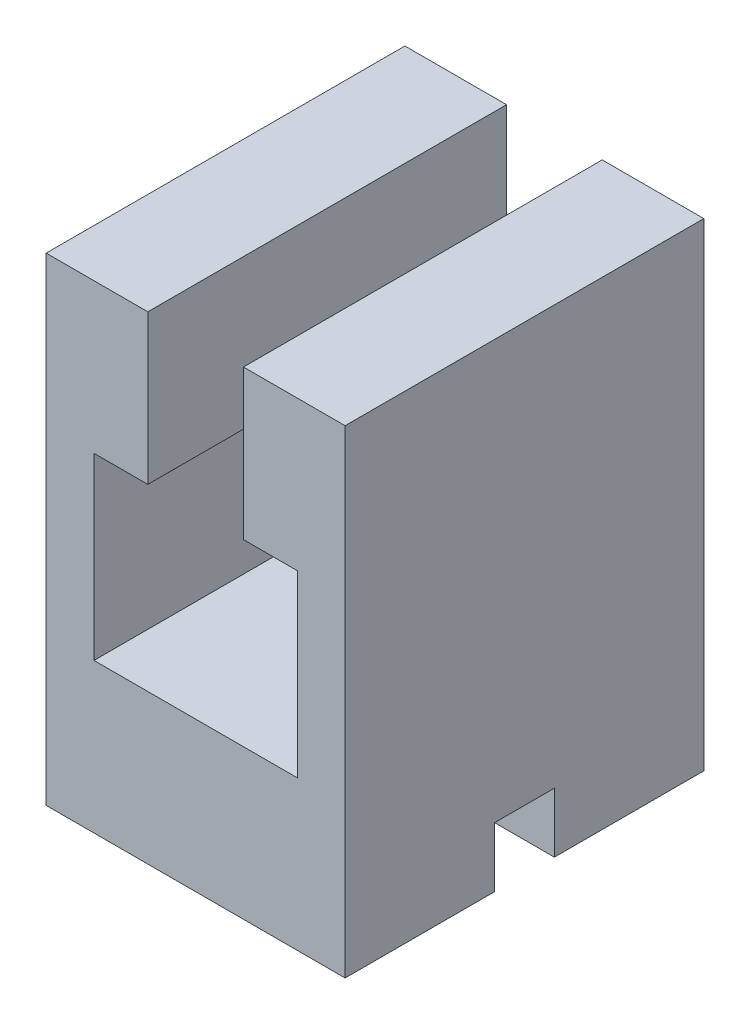
ISO-10303-21;
HEADER;
FILE_DESCRIPTION(('STEP AP214'),'2;1');
FILE_NAME('part.step','',(''),(''),'','','');
FILE_SCHEMA(('AUTOMOTIVE_DESIGN { 1 0 10303 214 1 1 1 1 }'));
ENDSEC;
DATA;
#1=APPLICATION_CONTEXT('core data for automotive mechanical design processes');
#2=APPLICATION_PROTOCOL_DEFINITION('international standard','automotive_design',2000,#1);
#3=PRODUCT_CONTEXT('',#1,'mechanical');
#4=PRODUCT('Part','Part','',(#3));
#5=PRODUCT_RELATED_PRODUCT_CATEGORY('part','',(#4));
#6=PRODUCT_DEFINITION_FORMATION('','',#4);
#7=PRODUCT_DEFINITION_CONTEXT('part definition',#1,'design');
#8=PRODUCT_DEFINITION('design','',#6,#7);
#9=PRODUCT_DEFINITION_SHAPE('','',#8);
#10=(LENGTH_UNIT() NAMED_UNIT(*) SI_UNIT(.MILLI.,.METRE.));
#11=(NAMED_UNIT(*) PLANE_ANGLE_UNIT() SI_UNIT($,.RADIAN.));
#12=(NAMED_UNIT(*) SI_UNIT($,.STERADIAN.) SOLID_ANGLE_UNIT());
#13=UNCERTAINTY_MEASURE_WITH_UNIT(LENGTH_MEASURE(1.E-05),#10,'distance_accuracy_value','');
#14=(GEOMETRIC_REPRESENTATION_CONTEXT(3) GLOBAL_UNCERTAINTY_ASSIGNED_CONTEXT((#13)) GLOBAL_UNIT_ASSIGNED_CONTEXT((#10,
#11,#12)) REPRESENTATION_CONTEXT('',''));
#15=CARTESIAN_POINT('',(0.,0.,0.));
#16=DIRECTION('',(0.,0.,1.));
#17=DIRECTION('',(1.,0.,0.));
#18=AXIS2_PLACEMENT_3D('',#15,#16,#17);
#19=CARTESIAN_POINT('',(-50.5403810221175,-30.6751493262531,60.));
#20=DIRECTION('',(0.,1.,0.));
#21=DIRECTION('',(0.,0.,1.));
#22=AXIS2_PLACEMENT_3D('',#19,#20,#21);
#23=PLANE('',#22);
#24=DIRECTION('',(0.,0.,-1.));
#25=VECTOR('',#24,1.);
#26=CARTESIAN_POINT('',(-0.540381022117523,-30.6751493262531,60.));
#27=LINE('',#26,#25);
#28=CARTESIAN_POINT('',(-0.540381022117523,-30.6751493262531,25.));
#29=VERTEX_POINT('',#28);
#30=CARTESIAN_POINT('',(-0.540381022117523,-30.6751493262531,0.));
#31=VERTEX_POINT('',#30);
#32=EDGE_CURVE('E245',#29,#31,#27,.T.);
#33=ORIENTED_EDGE('',*,*,#32,.F.);
#34=DIRECTION('',(-1.,0.,0.));
#35=VECTOR('',#34,1.);
#36=CARTESIAN_POINT('',(9.45961897788247,-30.6751493262531,25.));
#37=LINE('',#36,#35);
#38=CARTESIAN_POINT('',(-50.5403810221175,-30.6751493262531,25.));
#39=VERTEX_POINT('',#38);
#40=EDGE_CURVE('E288',#29,#39,#37,.T.);
#41=ORIENTED_EDGE('',*,*,#40,.T.);
#42=DIRECTION('',(0.,0.,-1.));
#43=VECTOR('',#42,1.);
#44=CARTESIAN_POINT('',(-50.5403810221175,-30.6751493262531,60.));
#45=LINE('',#44,#43);
#46=CARTESIAN_POINT('',(-50.5403810221175,-30.6751493262531,0.));
#47=VERTEX_POINT('',#46);
#48=EDGE_CURVE('E250',#39,#47,#45,.T.);
#49=ORIENTED_EDGE('',*,*,#48,.T.);
#50=DIRECTION('',(1.,0.,0.));
#51=VECTOR('',#50,1.);
#52=CARTESIAN_POINT('',(-50.5403810221175,-30.6751493262531,0.));
#53=LINE('',#52,#51);
#54=EDGE_CURVE('E181',#47,#31,#53,.T.);
#55=ORIENTED_EDGE('',*,*,#54,.T.);
#56=EDGE_LOOP('',(#33,#41,#49,#55));
#57=FACE_BOUND('',#56,.T.);
#58=ADVANCED_FACE('F39',(#57),#23,.F.);
#59=CARTESIAN_POINT('',(-50.5403810221175,49.3248506737469,60.));
#60=DIRECTION('',(1.,0.,0.));
#61=DIRECTION('',(0.,0.,-1.));
#62=AXIS2_PLACEMENT_3D('',#59,#60,#61);
#63=PLANE('',#62);
#64=ORIENTED_EDGE('',*,*,#48,.F.);
#65=DIRECTION('',(0.,-1.,0.));
#66=VECTOR('',#65,1.);
#67=CARTESIAN_POINT('',(-50.5403810221175,-30.6751493262531,25.));
#68=LINE('',#67,#66);
#69=CARTESIAN_POINT('',(-50.5403810221175,-20.6751493262531,25.));
#70=VERTEX_POINT('',#69);
#71=EDGE_CURVE('E359',#70,#39,#68,.T.);
#72=ORIENTED_EDGE('',*,*,#71,.F.);
#73=DIRECTION('',(0.,0.,-1.));
#74=VECTOR('',#73,1.);
#75=CARTESIAN_POINT('',(-50.5403810221175,-20.6751493262531,25.));
#76=LINE('',#75,#74);
#77=CARTESIAN_POINT('',(-50.5403810221175,-20.6751493262531,35.));
#78=VERTEX_POINT('',#77);
#79=EDGE_CURVE('E273',#78,#70,#76,.T.);
#80=ORIENTED_EDGE('',*,*,#79,.F.);
#81=DIRECTION('',(0.,1.,0.));
#82=VECTOR('',#81,1.);
#83=CARTESIAN_POINT('',(-50.5403810221175,-30.6751493262531,35.));
#84=LINE('',#83,#82);
#85=CARTESIAN_POINT('',(-50.5403810221175,-30.6751493262531,35.));
#86=VERTEX_POINT('',#85);
#87=EDGE_CURVE('E370',#86,#78,#84,.T.);
#88=ORIENTED_EDGE('',*,*,#87,.F.);
#89=CARTESIAN_POINT('',(-50.5403810221175,-30.6751493262531,60.));
#90=VERTEX_POINT('',#89);
#91=EDGE_CURVE('E251',#90,#86,#45,.T.);
#92=ORIENTED_EDGE('',*,*,#91,.F.);
#93=DIRECTION('',(0.,-1.,0.));
#94=VECTOR('',#93,1.);
#95=CARTESIAN_POINT('',(-50.5403810221175,49.3248506737469,60.));
#96=LINE('',#95,#94);
#97=CARTESIAN_POINT('',(-50.5403810221175,49.3248506737469,60.));
#98=VERTEX_POINT('',#97);
#99=EDGE_CURVE('E214',#98,#90,#96,.T.);
#100=ORIENTED_EDGE('',*,*,#99,.F.);
#101=DIRECTION('',(0.,0.,-1.));
#102=VECTOR('',#101,1.);
#103=CARTESIAN_POINT('',(-50.5403810221175,49.3248506737469,60.));
#104=LINE('',#103,#102);
#105=CARTESIAN_POINT('',(-50.5403810221175,49.3248506737469,0.));
#106=VERTEX_POINT('',#105);
#107=EDGE_CURVE('E173',#98,#106,#104,.T.);
#108=ORIENTED_EDGE('',*,*,#107,.T.);
#109=DIRECTION('',(0.,-1.,0.));
#110=VECTOR('',#109,1.);
#111=CARTESIAN_POINT('',(-50.5403810221175,49.3248506737469,0.));
#112=LINE('',#111,#110);
#113=EDGE_CURVE('E177',#106,#47,#112,.T.);
#114=ORIENTED_EDGE('',*,*,#113,.T.);
#115=EDGE_LOOP('',(#64,#72,#80,#88,#92,#100,#108,#114));
#116=FACE_BOUND('',#115,.T.);
#117=ADVANCED_FACE('F41',(#116),#63,.F.);
#118=ORIENTED_EDGE('',*,*,#91,.T.);
#119=DIRECTION('',(-1.,0.,0.));
#120=VECTOR('',#119,1.);
#121=CARTESIAN_POINT('',(9.45961897788247,-30.6751493262531,35.));
#122=LINE('',#121,#120);
#123=CARTESIAN_POINT('',(-0.540381022117523,-30.6751493262531,35.));
#124=VERTEX_POINT('',#123);
#125=EDGE_CURVE('E280',#124,#86,#122,.T.);
#126=ORIENTED_EDGE('',*,*,#125,.F.);
#127=CARTESIAN_POINT('',(-0.540381022117523,-30.6751493262531,60.));
#128=VERTEX_POINT('',#127);
#129=EDGE_CURVE('E246',#128,#124,#27,.T.);
#130=ORIENTED_EDGE('',*,*,#129,.F.);
#131=DIRECTION('',(1.,0.,0.));
#132=VECTOR('',#131,1.);
#133=CARTESIAN_POINT('',(-50.5403810221175,-30.6751493262531,60.));
#134=LINE('',#133,#132);
#135=EDGE_CURVE('E118',#90,#128,#134,.T.);
#136=ORIENTED_EDGE('',*,*,#135,.F.);
#137=EDGE_LOOP('',(#118,#126,#130,#136));
#138=FACE_BOUND('',#137,.T.);
#139=ADVANCED_FACE('F336',(#138),#23,.F.);
#140=CARTESIAN_POINT('',(-0.540381022117523,-30.6751493262531,60.));
#141=DIRECTION('',(-1.,0.,0.));
#142=DIRECTION('',(0.,0.,1.));
#143=AXIS2_PLACEMENT_3D('',#140,#141,#142);
#144=PLANE('',#143);
#145=DIRECTION('',(0.,0.,-1.));
#146=VECTOR('',#145,1.);
#147=CARTESIAN_POINT('',(-0.540381022117523,-20.6751493262531,60.));
#148=LINE('',#147,#146);
#149=CARTESIAN_POINT('',(-0.540381022117523,-20.6751493262531,35.));
#150=VERTEX_POINT('',#149);
#151=CARTESIAN_POINT('',(-0.540381022117523,-20.6751493262531,25.));
#152=VERTEX_POINT('',#151);
#153=EDGE_CURVE('E48',#150,#152,#148,.T.);
#154=ORIENTED_EDGE('',*,*,#153,.T.);
#155=DIRECTION('',(0.,-1.,0.));
#156=VECTOR('',#155,1.);
#157=CARTESIAN_POINT('',(-0.540381022117523,-30.6751493262531,25.));
#158=LINE('',#157,#156);
#159=EDGE_CURVE('E11',#152,#29,#158,.T.);
#160=ORIENTED_EDGE('',*,*,#159,.T.);
#161=ORIENTED_EDGE('',*,*,#32,.T.);
#162=DIRECTION('',(0.,1.,0.));
#163=VECTOR('',#162,1.);
#164=CARTESIAN_POINT('',(-0.540381022117523,-30.6751493262531,0.));
#165=LINE('',#164,#163);
#166=CARTESIAN_POINT('',(-0.540381022117523,49.3248506737469,0.));
#167=VERTEX_POINT('',#166);
#168=EDGE_CURVE('E186',#31,#167,#165,.T.);
#169=ORIENTED_EDGE('',*,*,#168,.T.);
#170=DIRECTION('',(0.,0.,-1.));
#171=VECTOR('',#170,1.);
#172=CARTESIAN_POINT('',(-0.540381022117523,49.3248506737469,60.));
#173=LINE('',#172,#171);
#174=CARTESIAN_POINT('',(-0.540381022117523,49.3248506737469,60.));
#175=VERTEX_POINT('',#174);
#176=EDGE_CURVE('E241',#175,#167,#173,.T.);
#177=ORIENTED_EDGE('',*,*,#176,.F.);
#178=DIRECTION('',(0.,1.,0.));
#179=VECTOR('',#178,1.);
#180=CARTESIAN_POINT('',(-0.540381022117523,-30.6751493262531,60.));
#181=LINE('',#180,#179);
#182=EDGE_CURVE('E296',#128,#175,#181,.T.);
#183=ORIENTED_EDGE('',*,*,#182,.F.);
#184=ORIENTED_EDGE('',*,*,#129,.T.);
#185=DIRECTION('',(0.,1.,0.));
#186=VECTOR('',#185,1.);
#187=CARTESIAN_POINT('',(-0.540381022117523,-30.6751493262531,35.));
#188=LINE('',#187,#186);
#189=EDGE_CURVE('E254',#124,#150,#188,.T.);
#190=ORIENTED_EDGE('',*,*,#189,.T.);
#191=EDGE_LOOP('',(#154,#160,#161,#169,#177,#183,#184,#190));
#192=FACE_BOUND('',#191,.T.);
#193=ADVANCED_FACE('F260',(#192),#144,.F.);
#194=CARTESIAN_POINT('',(-0.540381022117523,49.3248506737469,60.));
#195=DIRECTION('',(0.,-1.,0.));
#196=DIRECTION('',(0.,0.,-1.));
#197=AXIS2_PLACEMENT_3D('',#194,#195,#196);
#198=PLANE('',#197);
#199=DIRECTION('',(-1.,0.,0.));
#200=VECTOR('',#199,1.);
#201=CARTESIAN_POINT('',(-0.540381022117523,49.3248506737469,0.));
#202=LINE('',#201,#200);
#203=CARTESIAN_POINT('',(-17.5403810221175,49.3248506737469,0.));
#204=VERTEX_POINT('',#203);
#205=EDGE_CURVE('E189',#167,#204,#202,.T.);
#206=ORIENTED_EDGE('',*,*,#205,.T.);
#207=DIRECTION('',(0.,0.,-1.));
#208=VECTOR('',#207,1.);
#209=CARTESIAN_POINT('',(-17.5403810221175,49.3248506737469,60.));
#210=LINE('',#209,#208);
#211=CARTESIAN_POINT('',(-17.5403810221175,49.3248506737469,60.));
#212=VERTEX_POINT('',#211);
#213=EDGE_CURVE('E237',#212,#204,#210,.T.);
#214=ORIENTED_EDGE('',*,*,#213,.F.);
#215=DIRECTION('',(-1.,0.,0.));
#216=VECTOR('',#215,1.);
#217=CARTESIAN_POINT('',(-0.540381022117523,49.3248506737469,60.));
#218=LINE('',#217,#216);
#219=EDGE_CURVE('E299',#175,#212,#218,.T.);
#220=ORIENTED_EDGE('',*,*,#219,.F.);
#221=ORIENTED_EDGE('',*,*,#176,.T.);
#222=EDGE_LOOP('',(#206,#214,#220,#221));
#223=FACE_BOUND('',#222,.T.);
#224=ADVANCED_FACE('F342',(#223),#198,.F.);
#225=CARTESIAN_POINT('',(-17.5403810221175,49.3248506737469,60.));
#226=DIRECTION('',(1.,0.,0.));
#227=DIRECTION('',(0.,0.,-1.));
#228=AXIS2_PLACEMENT_3D('',#225,#226,#227);
#229=PLANE('',#228);
#230=DIRECTION('',(0.,-1.,0.));
#231=VECTOR('',#230,1.);
#232=CARTESIAN_POINT('',(-17.5403810221175,49.3248506737469,0.));
#233=LINE('',#232,#231);
#234=CARTESIAN_POINT('',(-17.5403810221175,24.3248506737469,0.));
#235=VERTEX_POINT('',#234);
#236=EDGE_CURVE('E192',#204,#235,#233,.T.);
#237=ORIENTED_EDGE('',*,*,#236,.T.);
#238=DIRECTION('',(0.,0.,-1.));
#239=VECTOR('',#238,1.);
#240=CARTESIAN_POINT('',(-17.5403810221175,24.3248506737469,60.));
#241=LINE('',#240,#239);
#242=CARTESIAN_POINT('',(-17.5403810221175,24.3248506737469,60.));
#243=VERTEX_POINT('',#242);
#244=EDGE_CURVE('E233',#243,#235,#241,.T.);
#245=ORIENTED_EDGE('',*,*,#244,.F.);
#246=DIRECTION('',(0.,-1.,0.));
#247=VECTOR('',#246,1.);
#248=CARTESIAN_POINT('',(-17.5403810221175,49.3248506737469,60.));
#249=LINE('',#248,#247);
#250=EDGE_CURVE('E302',#212,#243,#249,.T.);
#251=ORIENTED_EDGE('',*,*,#250,.F.);
#252=ORIENTED_EDGE('',*,*,#213,.T.);
#253=EDGE_LOOP('',(#237,#245,#251,#252));
#254=FACE_BOUND('',#253,.T.);
#255=ADVANCED_FACE('F348',(#254),#229,.F.);
#256=CARTESIAN_POINT('',(-17.5403810221175,24.3248506737469,60.));
#257=DIRECTION('',(0.,1.,0.));
#258=DIRECTION('',(0.,0.,1.));
#259=AXIS2_PLACEMENT_3D('',#256,#257,#258);
#260=PLANE('',#259);
#261=DIRECTION('',(1.,0.,0.));
#262=VECTOR('',#261,1.);
#263=CARTESIAN_POINT('',(-17.5403810221175,24.3248506737469,0.));
#264=LINE('',#263,#262);
#265=CARTESIAN_POINT('',(-8.54038102211752,24.3248506737469,0.));
#266=VERTEX_POINT('',#265);
#267=EDGE_CURVE('E195',#235,#266,#264,.T.);
#268=ORIENTED_EDGE('',*,*,#267,.T.);
#269=DIRECTION('',(0.,0.,-1.));
#270=VECTOR('',#269,1.);
#271=CARTESIAN_POINT('',(-8.54038102211752,24.3248506737469,60.));
#272=LINE('',#271,#270);
#273=CARTESIAN_POINT('',(-8.54038102211752,24.3248506737469,60.));
#274=VERTEX_POINT('',#273);
#275=EDGE_CURVE('E229',#274,#266,#272,.T.);
#276=ORIENTED_EDGE('',*,*,#275,.F.);
#277=DIRECTION('',(1.,0.,0.));
#278=VECTOR('',#277,1.);
#279=CARTESIAN_POINT('',(-17.5403810221175,24.3248506737469,60.));
#280=LINE('',#279,#278);
#281=EDGE_CURVE('E305',#243,#274,#280,.T.);
#282=ORIENTED_EDGE('',*,*,#281,.F.);
#283=ORIENTED_EDGE('',*,*,#244,.T.);
#284=EDGE_LOOP('',(#268,#276,#282,#283));
#285=FACE_BOUND('',#284,.T.);
#286=ADVANCED_FACE('F352',(#285),#260,.F.);
#287=CARTESIAN_POINT('',(-8.54038102211752,24.3248506737469,60.));
#288=DIRECTION('',(1.,0.,0.));
#289=DIRECTION('',(0.,0.,-1.));
#290=AXIS2_PLACEMENT_3D('',#287,#288,#289);
#291=PLANE('',#290);
#292=DIRECTION('',(0.,-1.,0.));
#293=VECTOR('',#292,1.);
#294=CARTESIAN_POINT('',(-8.54038102211752,24.3248506737469,0.));
#295=LINE('',#294,#293);
#296=CARTESIAN_POINT('',(-8.54038102211752,-5.67514932625309,0.));
#297=VERTEX_POINT('',#296);
#298=EDGE_CURVE('E198',#266,#297,#295,.T.);
#299=ORIENTED_EDGE('',*,*,#298,.T.);
#300=DIRECTION('',(0.,0.,-1.));
#301=VECTOR('',#300,1.);
#302=CARTESIAN_POINT('',(-8.54038102211752,-5.67514932625309,60.));
#303=LINE('',#302,#301);
#304=CARTESIAN_POINT('',(-8.54038102211752,-5.67514932625309,60.));
#305=VERTEX_POINT('',#304);
#306=EDGE_CURVE('E225',#305,#297,#303,.T.);
#307=ORIENTED_EDGE('',*,*,#306,.F.);
#308=DIRECTION('',(0.,-1.,0.));
#309=VECTOR('',#308,1.);
#310=CARTESIAN_POINT('',(-8.54038102211752,24.3248506737469,60.));
#311=LINE('',#310,#309);
#312=EDGE_CURVE('E308',#274,#305,#311,.T.);
#313=ORIENTED_EDGE('',*,*,#312,.F.);
#314=ORIENTED_EDGE('',*,*,#275,.T.);
#315=EDGE_LOOP('',(#299,#307,#313,#314));
#316=FACE_BOUND('',#315,.T.);
#317=ADVANCED_FACE('F355',(#316),#291,.F.);
#318=CARTESIAN_POINT('',(-8.54038102211752,-5.67514932625309,60.));
#319=DIRECTION('',(0.,-1.,0.));
#320=DIRECTION('',(0.,0.,-1.));
#321=AXIS2_PLACEMENT_3D('',#318,#319,#320);
#322=PLANE('',#321);
#323=DIRECTION('',(-1.,0.,0.));
#324=VECTOR('',#323,1.);
#325=CARTESIAN_POINT('',(-8.54038102211752,-5.67514932625309,0.));
#326=LINE('',#325,#324);
#327=CARTESIAN_POINT('',(-42.5403810221175,-5.67514932625309,0.));
#328=VERTEX_POINT('',#327);
#329=EDGE_CURVE('E201',#297,#328,#326,.T.);
#330=ORIENTED_EDGE('',*,*,#329,.T.);
#331=DIRECTION('',(0.,0.,-1.));
#332=VECTOR('',#331,1.);
#333=CARTESIAN_POINT('',(-42.5403810221175,-5.67514932625309,60.));
#334=LINE('',#333,#332);
#335=CARTESIAN_POINT('',(-42.5403810221175,-5.67514932625309,60.));
#336=VERTEX_POINT('',#335);
#337=EDGE_CURVE('E221',#336,#328,#334,.T.);
#338=ORIENTED_EDGE('',*,*,#337,.F.);
#339=DIRECTION('',(-1.,0.,0.));
#340=VECTOR('',#339,1.);
#341=CARTESIAN_POINT('',(-8.54038102211752,-5.67514932625309,60.));
#342=LINE('',#341,#340);
#343=EDGE_CURVE('E311',#305,#336,#342,.T.);
#344=ORIENTED_EDGE('',*,*,#343,.F.);
#345=ORIENTED_EDGE('',*,*,#306,.T.);
#346=EDGE_LOOP('',(#330,#338,#344,#345));
#347=FACE_BOUND('',#346,.T.);
#348=ADVANCED_FACE('F319',(#347),#322,.F.);
#349=CARTESIAN_POINT('',(-42.5403810221175,-5.67514932625309,60.));
#350=DIRECTION('',(-1.,0.,0.));
#351=DIRECTION('',(0.,0.,1.));
#352=AXIS2_PLACEMENT_3D('',#349,#350,#351);
#353=PLANE('',#352);
#354=DIRECTION('',(0.,1.,0.));
#355=VECTOR('',#354,1.);
#356=CARTESIAN_POINT('',(-42.5403810221175,-5.67514932625309,0.));
#357=LINE('',#356,#355);
#358=CARTESIAN_POINT('',(-42.5403810221175,24.3248506737469,0.));
#359=VERTEX_POINT('',#358);
#360=EDGE_CURVE('E204',#328,#359,#357,.T.);
#361=ORIENTED_EDGE('',*,*,#360,.T.);
#362=DIRECTION('',(0.,0.,-1.));
#363=VECTOR('',#362,1.);
#364=CARTESIAN_POINT('',(-42.5403810221175,24.3248506737469,60.));
#365=LINE('',#364,#363);
#366=CARTESIAN_POINT('',(-42.5403810221175,24.3248506737469,60.));
#367=VERTEX_POINT('',#366);
#368=EDGE_CURVE('E166',#367,#359,#365,.T.);
#369=ORIENTED_EDGE('',*,*,#368,.F.);
#370=DIRECTION('',(0.,1.,0.));
#371=VECTOR('',#370,1.);
#372=CARTESIAN_POINT('',(-42.5403810221175,-5.67514932625309,60.));
#373=LINE('',#372,#371);
#374=EDGE_CURVE('E152',#336,#367,#373,.T.);
#375=ORIENTED_EDGE('',*,*,#374,.F.);
#376=ORIENTED_EDGE('',*,*,#337,.T.);
#377=EDGE_LOOP('',(#361,#369,#375,#376));
#378=FACE_BOUND('',#377,.T.);
#379=ADVANCED_FACE('F323',(#378),#353,.F.);
#380=CARTESIAN_POINT('',(-42.5403810221175,24.3248506737469,60.));
#381=DIRECTION('',(0.,1.,0.));
#382=DIRECTION('',(0.,0.,1.));
#383=AXIS2_PLACEMENT_3D('',#380,#381,#382);
#384=PLANE('',#383);
#385=DIRECTION('',(1.,0.,0.));
#386=VECTOR('',#385,1.);
#387=CARTESIAN_POINT('',(-42.5403810221175,24.3248506737469,0.));
#388=LINE('',#387,#386);
#389=CARTESIAN_POINT('',(-33.5403810221175,24.3248506737469,0.));
#390=VERTEX_POINT('',#389);
#391=EDGE_CURVE('E162',#359,#390,#388,.T.);
#392=ORIENTED_EDGE('',*,*,#391,.T.);
#393=DIRECTION('',(0.,0.,-1.));
#394=VECTOR('',#393,1.);
#395=CARTESIAN_POINT('',(-33.5403810221175,24.3248506737469,60.));
#396=LINE('',#395,#394);
#397=CARTESIAN_POINT('',(-33.5403810221175,24.3248506737469,60.));
#398=VERTEX_POINT('',#397);
#399=EDGE_CURVE('E159',#398,#390,#396,.T.);
#400=ORIENTED_EDGE('',*,*,#399,.F.);
#401=DIRECTION('',(1.,0.,0.));
#402=VECTOR('',#401,1.);
#403=CARTESIAN_POINT('',(-42.5403810221175,24.3248506737469,60.));
#404=LINE('',#403,#402);
#405=EDGE_CURVE('E145',#367,#398,#404,.T.);
#406=ORIENTED_EDGE('',*,*,#405,.F.);
#407=ORIENTED_EDGE('',*,*,#368,.T.);
#408=EDGE_LOOP('',(#392,#400,#406,#407));
#409=FACE_BOUND('',#408,.T.);
#410=ADVANCED_FACE('F160',(#409),#384,.F.);
#411=CARTESIAN_POINT('',(-33.5403810221175,24.3248506737469,60.));
#412=DIRECTION('',(-1.,0.,0.));
#413=DIRECTION('',(0.,0.,1.));
#414=AXIS2_PLACEMENT_3D('',#411,#412,#413);
#415=PLANE('',#414);
#416=DIRECTION('',(0.,1.,0.));
#417=VECTOR('',#416,1.);
#418=CARTESIAN_POINT('',(-33.5403810221175,24.3248506737469,0.));
#419=LINE('',#418,#417);
#420=CARTESIAN_POINT('',(-33.5403810221175,49.3248506737469,0.));
#421=VERTEX_POINT('',#420);
#422=EDGE_CURVE('E209',#390,#421,#419,.T.);
#423=ORIENTED_EDGE('',*,*,#422,.T.);
#424=DIRECTION('',(0.,0.,-1.));
#425=VECTOR('',#424,1.);
#426=CARTESIAN_POINT('',(-33.5403810221175,49.3248506737469,60.));
#427=LINE('',#426,#425);
#428=CARTESIAN_POINT('',(-33.5403810221175,49.3248506737469,60.));
#429=VERTEX_POINT('',#428);
#430=EDGE_CURVE('E167',#429,#421,#427,.T.);
#431=ORIENTED_EDGE('',*,*,#430,.F.);
#432=DIRECTION('',(0.,1.,0.));
#433=VECTOR('',#432,1.);
#434=CARTESIAN_POINT('',(-33.5403810221175,24.3248506737469,60.));
#435=LINE('',#434,#433);
#436=EDGE_CURVE('E149',#398,#429,#435,.T.);
#437=ORIENTED_EDGE('',*,*,#436,.F.);
#438=ORIENTED_EDGE('',*,*,#399,.T.);
#439=EDGE_LOOP('',(#423,#431,#437,#438));
#440=FACE_BOUND('',#439,.T.);
#441=ADVANCED_FACE('F169',(#440),#415,.F.);
#442=CARTESIAN_POINT('',(-33.5403810221175,49.3248506737469,60.));
#443=DIRECTION('',(0.,-1.,0.));
#444=DIRECTION('',(0.,0.,-1.));
#445=AXIS2_PLACEMENT_3D('',#442,#443,#444);
#446=PLANE('',#445);
#447=DIRECTION('',(-1.,0.,0.));
#448=VECTOR('',#447,1.);
#449=CARTESIAN_POINT('',(-33.5403810221175,49.3248506737469,0.));
#450=LINE('',#449,#448);
#451=EDGE_CURVE('E109',#421,#106,#450,.T.);
#452=ORIENTED_EDGE('',*,*,#451,.T.);
#453=ORIENTED_EDGE('',*,*,#107,.F.);
#454=DIRECTION('',(-1.,0.,0.));
#455=VECTOR('',#454,1.);
#456=CARTESIAN_POINT('',(-33.5403810221175,49.3248506737469,60.));
#457=LINE('',#456,#455);
#458=EDGE_CURVE('E64',#429,#98,#457,.T.);
#459=ORIENTED_EDGE('',*,*,#458,.F.);
#460=ORIENTED_EDGE('',*,*,#430,.T.);
#461=EDGE_LOOP('',(#452,#453,#459,#460));
#462=FACE_BOUND('',#461,.T.);
#463=ADVANCED_FACE('F327',(#462),#446,.F.);
#464=CARTESIAN_POINT('',(0.,0.,60.));
#465=DIRECTION('',(0.,0.,1.));
#466=DIRECTION('',(1.,0.,0.));
#467=AXIS2_PLACEMENT_3D('',#464,#465,#466);
#468=PLANE('',#467);
#469=ORIENTED_EDGE('',*,*,#99,.T.);
#470=ORIENTED_EDGE('',*,*,#135,.T.);
#471=ORIENTED_EDGE('',*,*,#182,.T.);
#472=ORIENTED_EDGE('',*,*,#219,.T.);
#473=ORIENTED_EDGE('',*,*,#250,.T.);
#474=ORIENTED_EDGE('',*,*,#281,.T.);
#475=ORIENTED_EDGE('',*,*,#312,.T.);
#476=ORIENTED_EDGE('',*,*,#343,.T.);
#477=ORIENTED_EDGE('',*,*,#374,.T.);
#478=ORIENTED_EDGE('',*,*,#405,.T.);
#479=ORIENTED_EDGE('',*,*,#436,.T.);
#480=ORIENTED_EDGE('',*,*,#458,.T.);
#481=EDGE_LOOP('',(#469,#470,#471,#472,#473,#474,#475,#476,#477,#478,#479,#480));
#482=FACE_BOUND('',#481,.T.);
#483=ADVANCED_FACE('F147',(#482),#468,.T.);
#484=CARTESIAN_POINT('',(0.,0.,0.));
#485=DIRECTION('',(0.,0.,1.));
#486=DIRECTION('',(1.,0.,0.));
#487=AXIS2_PLACEMENT_3D('',#484,#485,#486);
#488=PLANE('',#487);
#489=ORIENTED_EDGE('',*,*,#113,.F.);
#490=ORIENTED_EDGE('',*,*,#451,.F.);
#491=ORIENTED_EDGE('',*,*,#422,.F.);
#492=ORIENTED_EDGE('',*,*,#391,.F.);
#493=ORIENTED_EDGE('',*,*,#360,.F.);
#494=ORIENTED_EDGE('',*,*,#329,.F.);
#495=ORIENTED_EDGE('',*,*,#298,.F.);
#496=ORIENTED_EDGE('',*,*,#267,.F.);
#497=ORIENTED_EDGE('',*,*,#236,.F.);
#498=ORIENTED_EDGE('',*,*,#205,.F.);
#499=ORIENTED_EDGE('',*,*,#168,.F.);
#500=ORIENTED_EDGE('',*,*,#54,.F.);
#501=EDGE_LOOP('',(#489,#490,#491,#492,#493,#494,#495,#496,#497,#498,#499,#500));
#502=FACE_BOUND('',#501,.T.);
#503=ADVANCED_FACE('F326',(#502),#488,.F.);
#504=CARTESIAN_POINT('',(9.45961897788247,-30.6751493262531,25.));
#505=DIRECTION('',(0.,0.,-1.));
#506=DIRECTION('',(-1.,0.,0.));
#507=AXIS2_PLACEMENT_3D('',#504,#505,#506);
#508=PLANE('',#507);
#509=DIRECTION('',(-1.,0.,0.));
#510=VECTOR('',#509,1.);
#511=CARTESIAN_POINT('',(9.45961897788247,-20.6751493262531,25.));
#512=LINE('',#511,#510);
#513=EDGE_CURVE('E182',#152,#70,#512,.T.);
#514=ORIENTED_EDGE('',*,*,#513,.T.);
#515=ORIENTED_EDGE('',*,*,#71,.T.);
#516=ORIENTED_EDGE('',*,*,#40,.F.);
#517=ORIENTED_EDGE('',*,*,#159,.F.);
#518=EDGE_LOOP('',(#514,#515,#516,#517));
#519=FACE_BOUND('',#518,.T.);
#520=ADVANCED_FACE('F375',(#519),#508,.F.);
#521=CARTESIAN_POINT('',(9.45961897788247,-20.6751493262531,25.));
#522=DIRECTION('',(0.,1.,0.));
#523=DIRECTION('',(0.,0.,1.));
#524=AXIS2_PLACEMENT_3D('',#521,#522,#523);
#525=PLANE('',#524);
#526=DIRECTION('',(-1.,0.,0.));
#527=VECTOR('',#526,1.);
#528=CARTESIAN_POINT('',(9.45961897788247,-20.6751493262531,35.));
#529=LINE('',#528,#527);
#530=EDGE_CURVE('E55',#150,#78,#529,.T.);
#531=ORIENTED_EDGE('',*,*,#530,.T.);
#532=ORIENTED_EDGE('',*,*,#79,.T.);
#533=ORIENTED_EDGE('',*,*,#513,.F.);
#534=ORIENTED_EDGE('',*,*,#153,.F.);
#535=EDGE_LOOP('',(#531,#532,#533,#534));
#536=FACE_BOUND('',#535,.T.);
#537=ADVANCED_FACE('F267',(#536),#525,.F.);
#538=CARTESIAN_POINT('',(9.45961897788247,-30.6751493262531,35.));
#539=DIRECTION('',(0.,0.,1.));
#540=DIRECTION('',(1.,0.,0.));
#541=AXIS2_PLACEMENT_3D('',#538,#539,#540);
#542=PLANE('',#541);
#543=ORIENTED_EDGE('',*,*,#125,.T.);
#544=ORIENTED_EDGE('',*,*,#87,.T.);
#545=ORIENTED_EDGE('',*,*,#530,.F.);
#546=ORIENTED_EDGE('',*,*,#189,.F.);
#547=EDGE_LOOP('',(#543,#544,#545,#546));
#548=FACE_BOUND('',#547,.T.);
#549=ADVANCED_FACE('F369',(#548),#542,.F.);
#550=CLOSED_SHELL('',(#58,#117,#139,#193,#224,#255,#286,#317,#348,#379,#410,#441,#463,#483,#503,
#520,#537,#549));
#551=MANIFOLD_SOLID_BREP('B2',#550);
#552=ADVANCED_BREP_SHAPE_REPRESENTATION('',(#18,#551),#14);
#553=SHAPE_DEFINITION_REPRESENTATION(#9,#552);
ENDSEC;
END-ISO-10303-21;
